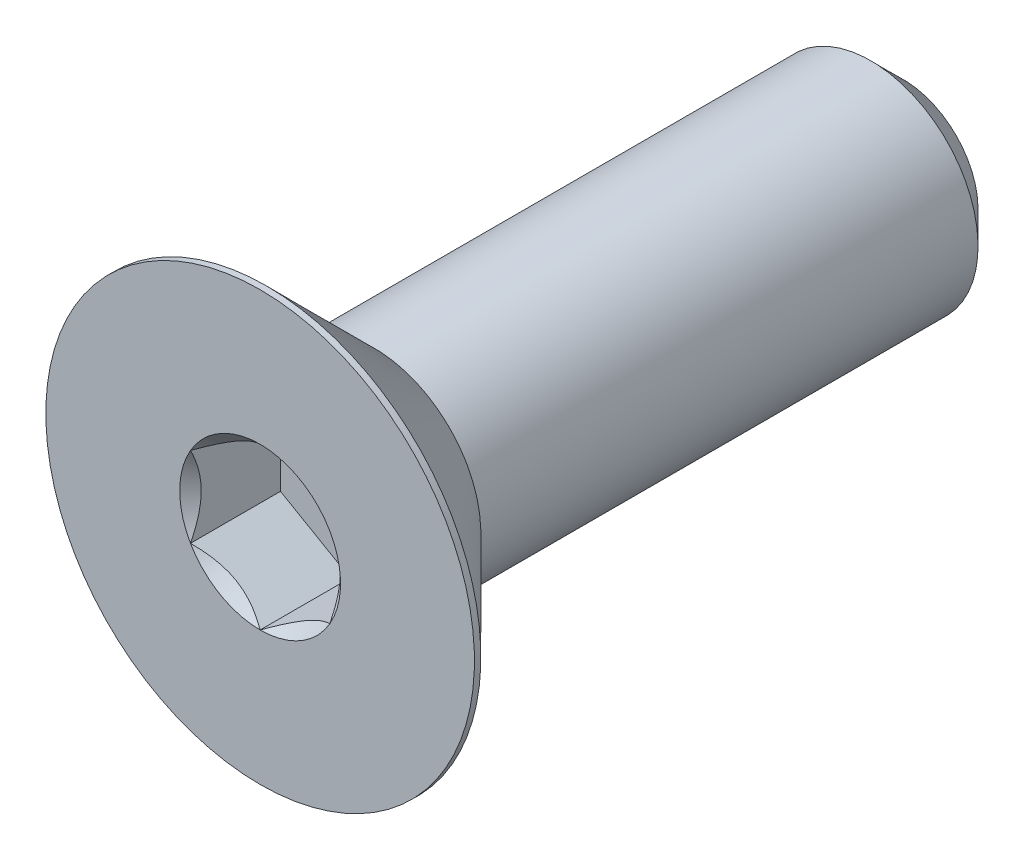
ISO-10303-21;
HEADER;
FILE_DESCRIPTION(('STEP AP214'),'2;1');
FILE_NAME('part.step','',(''),(''),'','','');
FILE_SCHEMA(('AUTOMOTIVE_DESIGN { 1 0 10303 214 1 1 1 1 }'));
ENDSEC;
DATA;
#1=APPLICATION_CONTEXT('core data for automotive mechanical design processes');
#2=APPLICATION_PROTOCOL_DEFINITION('international standard','automotive_design',2000,#1);
#3=PRODUCT_CONTEXT('',#1,'mechanical');
#4=PRODUCT('Part','Part','',(#3));
#5=PRODUCT_RELATED_PRODUCT_CATEGORY('part','',(#4));
#6=PRODUCT_DEFINITION_FORMATION('','',#4);
#7=PRODUCT_DEFINITION_CONTEXT('part definition',#1,'design');
#8=PRODUCT_DEFINITION('design','',#6,#7);
#9=PRODUCT_DEFINITION_SHAPE('','',#8);
#10=(LENGTH_UNIT() NAMED_UNIT(*) SI_UNIT(.MILLI.,.METRE.));
#11=(NAMED_UNIT(*) PLANE_ANGLE_UNIT() SI_UNIT($,.RADIAN.));
#12=(NAMED_UNIT(*) SI_UNIT($,.STERADIAN.) SOLID_ANGLE_UNIT());
#13=UNCERTAINTY_MEASURE_WITH_UNIT(LENGTH_MEASURE(1.E-05),#10,'distance_accuracy_value','');
#14=(GEOMETRIC_REPRESENTATION_CONTEXT(3) GLOBAL_UNCERTAINTY_ASSIGNED_CONTEXT((#13)) GLOBAL_UNIT_ASSIGNED_CONTEXT((#10,
#11,#12)) REPRESENTATION_CONTEXT('',''));
#15=CARTESIAN_POINT('',(0.,0.,0.));
#16=DIRECTION('',(0.,0.,1.));
#17=DIRECTION('',(1.,0.,0.));
#18=AXIS2_PLACEMENT_3D('',#15,#16,#17);
#19=CARTESIAN_POINT('',(0.,0.,3.));
#20=DIRECTION('',(0.,0.,-1.));
#21=DIRECTION('',(0.,1.,0.));
#22=AXIS2_PLACEMENT_3D('',#19,#20,#21);
#23=PLANE('',#22);
#24=CARTESIAN_POINT('',(0.,0.,3.));
#25=DIRECTION('',(0.,0.,1.));
#26=DIRECTION('',(0.,-1.,0.));
#27=AXIS2_PLACEMENT_3D('',#24,#25,#26);
#28=CIRCLE('',#27,2.);
#29=CARTESIAN_POINT('',(0.,-2.,3.));
#30=VERTEX_POINT('',#29);
#31=EDGE_CURVE('E228',#30,#30,#28,.T.);
#32=ORIENTED_EDGE('',*,*,#31,.T.);
#33=EDGE_LOOP('',(#32));
#34=FACE_BOUND('',#33,.T.);
#35=CARTESIAN_POINT('',(0.,0.,3.));
#36=DIRECTION('',(0.,0.,-1.));
#37=DIRECTION('',(-1.,0.,0.));
#38=AXIS2_PLACEMENT_3D('',#35,#36,#37);
#39=CIRCLE('',#38,0.750555349946515);
#40=CARTESIAN_POINT('',(-0.650000000000003,0.375277674973255,3.));
#41=VERTEX_POINT('',#40);
#42=CARTESIAN_POINT('',(0.,0.750555349946516,3.));
#43=VERTEX_POINT('',#42);
#44=EDGE_CURVE('E144',#41,#43,#39,.T.);
#45=ORIENTED_EDGE('',*,*,#44,.T.);
#46=CARTESIAN_POINT('',(0.650000000000002,0.375277674973256,3.));
#47=VERTEX_POINT('',#46);
#48=EDGE_CURVE('E143',#43,#47,#39,.T.);
#49=ORIENTED_EDGE('',*,*,#48,.T.);
#50=CARTESIAN_POINT('',(0.650000000000002,-0.375277674973256,3.));
#51=VERTEX_POINT('',#50);
#52=EDGE_CURVE('E115',#47,#51,#39,.T.);
#53=ORIENTED_EDGE('',*,*,#52,.T.);
#54=CARTESIAN_POINT('',(0.,-0.750555349946515,3.));
#55=VERTEX_POINT('',#54);
#56=EDGE_CURVE('E108',#51,#55,#39,.T.);
#57=ORIENTED_EDGE('',*,*,#56,.T.);
#58=CARTESIAN_POINT('',(-0.650000000000001,-0.375277674973258,3.));
#59=VERTEX_POINT('',#58);
#60=EDGE_CURVE('E69',#55,#59,#39,.T.);
#61=ORIENTED_EDGE('',*,*,#60,.T.);
#62=EDGE_CURVE('E76',#59,#41,#39,.T.);
#63=ORIENTED_EDGE('',*,*,#62,.T.);
#64=EDGE_LOOP('',(#45,#49,#53,#57,#61,#63));
#65=FACE_BOUND('',#64,.T.);
#66=ADVANCED_FACE('F49',(#34,#65),#23,.F.);
#67=CARTESIAN_POINT('',(0.,0.,2.94000000000001));
#68=DIRECTION('',(0.,0.,1.));
#69=DIRECTION('',(0.,-1.,0.));
#70=AXIS2_PLACEMENT_3D('',#67,#68,#69);
#71=CONICAL_SURFACE('',#70,2.,0.785398163397448);
#72=CARTESIAN_POINT('',(0.,0.,1.8));
#73=DIRECTION('',(0.,0.,1.));
#74=DIRECTION('',(0.,-1.,0.));
#75=AXIS2_PLACEMENT_3D('',#72,#73,#74);
#76=CIRCLE('',#75,0.859999999999998);
#77=CARTESIAN_POINT('',(0.,-0.859999999999998,1.8));
#78=VERTEX_POINT('',#77);
#79=EDGE_CURVE('E229',#78,#78,#76,.T.);
#80=ORIENTED_EDGE('',*,*,#79,.T.);
#81=EDGE_LOOP('',(#80));
#82=FACE_BOUND('',#81,.T.);
#83=CARTESIAN_POINT('',(0.,0.,2.94000000000001));
#84=DIRECTION('',(0.,0.,1.));
#85=DIRECTION('',(0.,-1.,0.));
#86=AXIS2_PLACEMENT_3D('',#83,#84,#85);
#87=CIRCLE('',#86,2.);
#88=CARTESIAN_POINT('',(0.,-2.,2.94000000000001));
#89=VERTEX_POINT('',#88);
#90=EDGE_CURVE('E63',#89,#89,#87,.T.);
#91=ORIENTED_EDGE('',*,*,#90,.F.);
#92=EDGE_LOOP('',(#91));
#93=FACE_BOUND('',#92,.T.);
#94=ADVANCED_FACE('F51',(#82,#93),#71,.T.);
#95=CARTESIAN_POINT('',(0.,0.,3.));
#96=DIRECTION('',(0.,0.,1.));
#97=DIRECTION('',(0.,-1.,0.));
#98=AXIS2_PLACEMENT_3D('',#95,#96,#97);
#99=CYLINDRICAL_SURFACE('',#98,2.);
#100=ORIENTED_EDGE('',*,*,#90,.T.);
#101=EDGE_LOOP('',(#100));
#102=FACE_BOUND('',#101,.T.);
#103=ORIENTED_EDGE('',*,*,#31,.F.);
#104=EDGE_LOOP('',(#103));
#105=FACE_BOUND('',#104,.T.);
#106=ADVANCED_FACE('F213',(#102,#105),#99,.T.);
#107=CARTESIAN_POINT('',(0.,0.,1.8));
#108=DIRECTION('',(0.,0.,-1.));
#109=DIRECTION('',(0.,1.,0.));
#110=AXIS2_PLACEMENT_3D('',#107,#108,#109);
#111=PLANE('',#110);
#112=ORIENTED_EDGE('',*,*,#79,.F.);
#113=EDGE_LOOP('',(#112));
#114=FACE_BOUND('',#113,.T.);
#115=ADVANCED_FACE('F217',(#114),#111,.T.);
#116=CARTESIAN_POINT('',(0.,0.,3.));
#117=DIRECTION('',(0.,0.,1.));
#118=DIRECTION('',(-1.,0.,0.));
#119=AXIS2_PLACEMENT_3D('',#116,#117,#118);
#120=CONICAL_SURFACE('',#119,0.750555349946515,0.78539816339745);
#121=CARTESIAN_POINT('',(0.650000000000002,-0.748456856202004,3.24075069038401));
#122=CARTESIAN_POINT('',(0.650000000000002,-0.711991073878827,3.21328028593363));
#123=CARTESIAN_POINT('',(0.650000000000002,-0.675139640082804,3.1862651954762));
#124=CARTESIAN_POINT('',(0.650000000000002,-0.600031183452829,3.13362934828317));
#125=CARTESIAN_POINT('',(0.650000000000002,-0.561765441270903,3.1080211061291));
#126=CARTESIAN_POINT('',(0.650000000000002,-0.481525479406327,3.05773749376247));
#127=CARTESIAN_POINT('',(0.650000000000002,-0.439464253670492,3.03319880219876));
#128=CARTESIAN_POINT('',(0.650000000000002,-0.353242719412724,2.98831465969864));
#129=CARTESIAN_POINT('',(0.650000000000002,-0.309090130602529,2.96795507248949));
#130=CARTESIAN_POINT('',(0.650000000000002,-0.242810057498672,2.94304872908866));
#131=CARTESIAN_POINT('',(0.650000000000002,-0.221667349821692,2.93590072741472));
#132=CARTESIAN_POINT('',(0.650000000000002,-0.178882845085545,2.92329752945255));
#133=CARTESIAN_POINT('',(0.650000000000002,-0.157241013753966,2.91784244978313));
#134=CARTESIAN_POINT('',(0.650000000000002,-0.0924732258239357,2.90466076531023));
#135=CARTESIAN_POINT('',(0.650000000000002,-0.0486986201802786,2.89979355976944));
#136=CARTESIAN_POINT('',(0.650000000000002,0.0373331587621231,2.89914448923078));
#137=CARTESIAN_POINT('',(0.650000000000002,0.0795879418799262,2.90304033931981));
#138=CARTESIAN_POINT('',(0.650000000000002,0.142230570834975,2.91449232559784));
#139=CARTESIAN_POINT('',(0.650000000000002,0.163174856664669,2.91931456423673));
#140=CARTESIAN_POINT('',(0.650000000000002,0.204615212735414,2.93060009995474));
#141=CARTESIAN_POINT('',(0.650000000000002,0.225111320324617,2.93706325972015));
#142=CARTESIAN_POINT('',(0.650000000000002,0.289638534772371,2.95984409213164));
#143=CARTESIAN_POINT('',(0.650000000000002,0.332748206875051,2.9787572451342));
#144=CARTESIAN_POINT('',(0.650000000000002,0.416943840013234,3.02081128188878));
#145=CARTESIAN_POINT('',(0.650000000000002,0.45802183453077,3.04396735475778));
#146=CARTESIAN_POINT('',(0.650000000000002,0.536529233245991,3.09172663971809));
#147=CARTESIAN_POINT('',(0.650000000000002,0.574038509134623,3.11620075812716));
#148=CARTESIAN_POINT('',(0.650000000000002,0.647609691485458,3.16662345601489));
#149=CARTESIAN_POINT('',(0.650000000000002,0.683680924535921,3.19255834365529));
#150=CARTESIAN_POINT('',(0.650000000000002,0.719356204751143,3.21896687739743));
#151=B_SPLINE_CURVE_WITH_KNOTS('',3,(#121,#122,#123,#124,#125,#126,#127,#128,#129,#130,#131,
#132,#133,#134,#135,#136,#137,#138,#139,#140,#141,#142,#143,#144,#145,#146,#147,#148,#149,#150),
.UNSPECIFIED.,.F.,.F.,(4,2,2,2,2,2,2,2,2,2,2,2,2,2,4),(0.,0.13701403000958,0.275096405762555,
0.421060359835528,0.566522128775098,0.633415056462926,0.70031259112181,0.831534924508346,
0.958010408789909,1.02242898521266,1.08684217280829,1.22766018796414,1.36899252873704,
1.50330165960874,1.63651263433844),.UNSPECIFIED.);
#152=EDGE_CURVE('E12',#47,#51,#151,.F.);
#153=ORIENTED_EDGE('',*,*,#152,.T.);
#154=ORIENTED_EDGE('',*,*,#52,.F.);
#155=EDGE_LOOP('',(#153,#154));
#156=FACE_BOUND('',#155,.T.);
#157=ADVANCED_FACE('F120',(#156),#120,.F.);
#158=CARTESIAN_POINT('',(-0.000199999999999783,0.750670820000351,3.00011549669667));
#159=CARTESIAN_POINT('',(0.0221538754426208,0.737764803996123,2.98721736219155));
#160=CARTESIAN_POINT('',(0.0448801205326127,0.724643800275747,2.97507515489864));
#161=CARTESIAN_POINT('',(0.0912219846432824,0.697888312556702,2.95284224486223));
#162=CARTESIAN_POINT('',(0.114842019040596,0.684251279339145,2.94276392481001));
#163=CARTESIAN_POINT('',(0.162473808706856,0.656751052753347,2.92550151642337));
#164=CARTESIAN_POINT('',(0.186473364593086,0.642894902702,2.91827395851558));
#165=CARTESIAN_POINT('',(0.234989410245209,0.614884150684731,2.90712920200001));
#166=CARTESIAN_POINT('',(0.25950444404188,0.60073038932303,2.90320370262187));
#167=CARTESIAN_POINT('',(0.31938440233592,0.566158679282903,2.89822343733471));
#168=CARTESIAN_POINT('',(0.354889192903235,0.545659978891342,2.89912448479266));
#169=CARTESIAN_POINT('',(0.425154552317994,0.505092254718525,2.90840856131667));
#170=CARTESIAN_POINT('',(0.459913930439301,0.485023918403324,2.91680276302966));
#171=CARTESIAN_POINT('',(0.52095826250894,0.449779956850418,2.9370456785073));
#172=CARTESIAN_POINT('',(0.547523861415086,0.434442301170771,2.9478384232645));
#173=CARTESIAN_POINT('',(0.599614154899068,0.404367956205627,2.9721519314496));
#174=CARTESIAN_POINT('',(0.625141918825038,0.389629494831159,2.98566382100729));
#175=CARTESIAN_POINT('',(0.650200000000002,0.375162204919418,3.00011549669668));
#176=B_SPLINE_CURVE_WITH_KNOTS('',3,(#158,#159,#160,#161,#162,#163,#164,#165,#166,#167,#168,
#169,#170,#171,#172,#173,#174,#175),.UNSPECIFIED.,.F.,.F.,(4,2,2,2,2,2,2,2,4),(0.,
0.0866236559063441,0.173752711623242,0.259496442803568,0.345023980281752,0.467267720550124,
0.589694037029335,0.687111308755481,0.784215671813668),.UNSPECIFIED.);
#177=EDGE_CURVE('E146',#43,#47,#176,.T.);
#178=ORIENTED_EDGE('',*,*,#177,.T.);
#179=ORIENTED_EDGE('',*,*,#48,.F.);
#180=EDGE_LOOP('',(#178,#179));
#181=FACE_BOUND('',#180,.T.);
#182=ADVANCED_FACE('F267',(#181),#120,.F.);
#183=CARTESIAN_POINT('',(-0.650200000000001,0.375162204919418,3.00011549669668));
#184=CARTESIAN_POINT('',(-0.627846124557381,0.388068220923646,2.98721736219155));
#185=CARTESIAN_POINT('',(-0.605119879467389,0.401189224644023,2.97507515489864));
#186=CARTESIAN_POINT('',(-0.558778015356719,0.427944712363067,2.95284224486223));
#187=CARTESIAN_POINT('',(-0.535157980959404,0.441581745580625,2.94276392481001));
#188=CARTESIAN_POINT('',(-0.487526191293145,0.469081972166423,2.92550151642338));
#189=CARTESIAN_POINT('',(-0.463526635406915,0.48293812221777,2.91827395851558));
#190=CARTESIAN_POINT('',(-0.415010589754791,0.510948874235039,2.90712920200001));
#191=CARTESIAN_POINT('',(-0.390495555958119,0.52510263559674,2.90320370262187));
#192=CARTESIAN_POINT('',(-0.33061559766408,0.559674345636867,2.89822343733471));
#193=CARTESIAN_POINT('',(-0.295110807096765,0.580173046028428,2.89912448479266));
#194=CARTESIAN_POINT('',(-0.224845447682006,0.620740770201245,2.90840856131667));
#195=CARTESIAN_POINT('',(-0.190086069560699,0.640809106516446,2.91680276302966));
#196=CARTESIAN_POINT('',(-0.129041737491061,0.676053068069352,2.9370456785073));
#197=CARTESIAN_POINT('',(-0.102476138584915,0.691390723748999,2.9478384232645));
#198=CARTESIAN_POINT('',(-0.0503858451009331,0.721465068714143,2.9721519314496));
#199=CARTESIAN_POINT('',(-0.0248580811749639,0.73620353008861,2.98566382100729));
#200=CARTESIAN_POINT('',(0.000200000000000409,0.750670820000351,3.00011549669667));
#201=B_SPLINE_CURVE_WITH_KNOTS('',3,(#183,#184,#185,#186,#187,#188,#189,#190,#191,#192,#193,
#194,#195,#196,#197,#198,#199,#200),.UNSPECIFIED.,.F.,.F.,(4,2,2,2,2,2,2,2,4),(0.,
0.0866236559063447,0.173752711623243,0.25949644280357,0.345023980281754,0.467267720550127,
0.589694037029337,0.687111308755482,0.784215671813668),.UNSPECIFIED.);
#202=EDGE_CURVE('E153',#41,#43,#201,.T.);
#203=ORIENTED_EDGE('',*,*,#202,.T.);
#204=ORIENTED_EDGE('',*,*,#44,.F.);
#205=EDGE_LOOP('',(#203,#204));
#206=FACE_BOUND('',#205,.T.);
#207=ADVANCED_FACE('F263',(#206),#120,.F.);
#208=CARTESIAN_POINT('',(-0.650000000000001,-0.748456856202007,3.24075069038402));
#209=CARTESIAN_POINT('',(-0.650000000000001,-0.711991073878829,3.21328028593363));
#210=CARTESIAN_POINT('',(-0.650000000000001,-0.675139640082806,3.1862651954762));
#211=CARTESIAN_POINT('',(-0.650000000000001,-0.60003118345283,3.13362934828317));
#212=CARTESIAN_POINT('',(-0.650000000000001,-0.561765441270904,3.1080211061291));
#213=CARTESIAN_POINT('',(-0.650000000000001,-0.481525479406329,3.05773749376247));
#214=CARTESIAN_POINT('',(-0.650000000000001,-0.439464253670493,3.03319880219876));
#215=CARTESIAN_POINT('',(-0.650000000000001,-0.353242719412725,2.98831465969864));
#216=CARTESIAN_POINT('',(-0.650000000000001,-0.30909013060253,2.96795507248949));
#217=CARTESIAN_POINT('',(-0.650000000000001,-0.242810057498673,2.94304872908865));
#218=CARTESIAN_POINT('',(-0.650000000000001,-0.221667349821693,2.93590072741472));
#219=CARTESIAN_POINT('',(-0.650000000000001,-0.178882845085546,2.92329752945255));
#220=CARTESIAN_POINT('',(-0.650000000000001,-0.157241013753967,2.91784244978313));
#221=CARTESIAN_POINT('',(-0.650000000000001,-0.0924732258239366,2.90466076531023));
#222=CARTESIAN_POINT('',(-0.650000000000001,-0.0486986201802795,2.89979355976944));
#223=CARTESIAN_POINT('',(-0.650000000000001,0.0373331587621224,2.89914448923078));
#224=CARTESIAN_POINT('',(-0.650000000000001,0.0795879418799256,2.90304033931981));
#225=CARTESIAN_POINT('',(-0.650000000000001,0.142230570834974,2.91449232559783));
#226=CARTESIAN_POINT('',(-0.650000000000001,0.163174856664668,2.91931456423673));
#227=CARTESIAN_POINT('',(-0.650000000000001,0.204615212735413,2.93060009995474));
#228=CARTESIAN_POINT('',(-0.650000000000001,0.225111320324616,2.93706325972015));
#229=CARTESIAN_POINT('',(-0.650000000000002,0.28963853477237,2.95984409213164));
#230=CARTESIAN_POINT('',(-0.650000000000001,0.332748206875051,2.9787572451342));
#231=CARTESIAN_POINT('',(-0.650000000000001,0.416943840013234,3.02081128188878));
#232=CARTESIAN_POINT('',(-0.650000000000001,0.45802183453077,3.04396735475778));
#233=CARTESIAN_POINT('',(-0.650000000000001,0.536529233245989,3.09172663971809));
#234=CARTESIAN_POINT('',(-0.650000000000002,0.574038509134622,3.11620075812716));
#235=CARTESIAN_POINT('',(-0.650000000000002,0.647609691485457,3.16662345601488));
#236=CARTESIAN_POINT('',(-0.650000000000002,0.68368092453592,3.19255834365529));
#237=CARTESIAN_POINT('',(-0.650000000000002,0.719356204751141,3.21896687739743));
#238=B_SPLINE_CURVE_WITH_KNOTS('',3,(#208,#209,#210,#211,#212,#213,#214,#215,#216,#217,#218,
#219,#220,#221,#222,#223,#224,#225,#226,#227,#228,#229,#230,#231,#232,#233,#234,#235,#236,#237),
.UNSPECIFIED.,.F.,.F.,(4,2,2,2,2,2,2,2,2,2,2,2,2,2,4),(0.,0.137014030009581,0.275096405762556,
0.42106035983553,0.5665221287751,0.633415056462928,0.700312591121813,0.831534924508348,
0.958010408789912,1.02242898521267,1.0868421728083,1.22766018796414,1.36899252873705,
1.50330165960874,1.63651263433844),.UNSPECIFIED.);
#239=EDGE_CURVE('E173',#59,#41,#238,.T.);
#240=ORIENTED_EDGE('',*,*,#239,.T.);
#241=ORIENTED_EDGE('',*,*,#62,.F.);
#242=EDGE_LOOP('',(#240,#241));
#243=FACE_BOUND('',#242,.T.);
#244=ADVANCED_FACE('F273',(#243),#120,.F.);
#245=CARTESIAN_POINT('',(0.000199999999999492,-0.750670820000355,3.00011549669668));
#246=CARTESIAN_POINT('',(-0.0221538754426212,-0.737764803996126,2.98721736219155));
#247=CARTESIAN_POINT('',(-0.0448801205326133,-0.72464380027575,2.97507515489864));
#248=CARTESIAN_POINT('',(-0.0912219846432834,-0.697888312556705,2.95284224486223));
#249=CARTESIAN_POINT('',(-0.114842019040598,-0.684251279339148,2.94276392481001));
#250=CARTESIAN_POINT('',(-0.162473808706857,-0.656751052753349,2.92550151642338));
#251=CARTESIAN_POINT('',(-0.186473364593087,-0.642894902702003,2.91827395851558));
#252=CARTESIAN_POINT('',(-0.234989410245211,-0.614884150684733,2.90712920200001));
#253=CARTESIAN_POINT('',(-0.259504444041883,-0.600730389323032,2.90320370262187));
#254=CARTESIAN_POINT('',(-0.319384402335922,-0.566158679282905,2.89822343733471));
#255=CARTESIAN_POINT('',(-0.354889192903237,-0.545659978891344,2.89912448479266));
#256=CARTESIAN_POINT('',(-0.425154552317997,-0.505092254718527,2.90840856131667));
#257=CARTESIAN_POINT('',(-0.459913930439304,-0.485023918403326,2.91680276302966));
#258=CARTESIAN_POINT('',(-0.520958262508942,-0.44977995685042,2.9370456785073));
#259=CARTESIAN_POINT('',(-0.547523861415088,-0.434442301170773,2.94783842326451));
#260=CARTESIAN_POINT('',(-0.599614154899068,-0.40436795620563,2.97215193144961));
#261=CARTESIAN_POINT('',(-0.625141918825037,-0.389629494831163,2.98566382100729));
#262=CARTESIAN_POINT('',(-0.650200000000001,-0.375162204919422,3.00011549669668));
#263=B_SPLINE_CURVE_WITH_KNOTS('',3,(#245,#246,#247,#248,#249,#250,#251,#252,#253,#254,#255,
#256,#257,#258,#259,#260,#261,#262),.UNSPECIFIED.,.F.,.F.,(4,2,2,2,2,2,2,2,4),(0.,
0.0866236559063448,0.173752711623243,0.25949644280357,0.345023980281754,0.467267720550128,
0.589694037029339,0.687111308755482,0.784215671813666),.UNSPECIFIED.);
#264=EDGE_CURVE('E132',#55,#59,#263,.T.);
#265=ORIENTED_EDGE('',*,*,#264,.T.);
#266=ORIENTED_EDGE('',*,*,#60,.F.);
#267=EDGE_LOOP('',(#265,#266));
#268=FACE_BOUND('',#267,.T.);
#269=ADVANCED_FACE('F166',(#268),#120,.F.);
#270=CARTESIAN_POINT('',(0.650200000000002,-0.375162204919421,3.00011549669668));
#271=CARTESIAN_POINT('',(0.627846124557381,-0.388068220923649,2.98721736219155));
#272=CARTESIAN_POINT('',(0.605119879467389,-0.401189224644025,2.97507515489864));
#273=CARTESIAN_POINT('',(0.558778015356719,-0.42794471236307,2.95284224486223));
#274=CARTESIAN_POINT('',(0.535157980959405,-0.441581745580627,2.94276392481001));
#275=CARTESIAN_POINT('',(0.487526191293146,-0.469081972166426,2.92550151642338));
#276=CARTESIAN_POINT('',(0.463526635406915,-0.482938122217772,2.91827395851558));
#277=CARTESIAN_POINT('',(0.415010589754792,-0.510948874235042,2.90712920200001));
#278=CARTESIAN_POINT('',(0.39049555595812,-0.525102635596743,2.90320370262187));
#279=CARTESIAN_POINT('',(0.330615597664081,-0.55967434563687,2.89822343733471));
#280=CARTESIAN_POINT('',(0.295110807096766,-0.580173046028431,2.89912448479266));
#281=CARTESIAN_POINT('',(0.224845447682006,-0.620740770201248,2.90840856131667));
#282=CARTESIAN_POINT('',(0.190086069560699,-0.640809106516449,2.91680276302966));
#283=CARTESIAN_POINT('',(0.129041737491061,-0.676053068069356,2.9370456785073));
#284=CARTESIAN_POINT('',(0.102476138584915,-0.691390723749003,2.94783842326451));
#285=CARTESIAN_POINT('',(0.050385845100933,-0.721465068714146,2.97215193144961));
#286=CARTESIAN_POINT('',(0.0248580811749639,-0.736203530088614,2.98566382100729));
#287=CARTESIAN_POINT('',(-0.000200000000000477,-0.750670820000355,3.00011549669668));
#288=B_SPLINE_CURVE_WITH_KNOTS('',3,(#270,#271,#272,#273,#274,#275,#276,#277,#278,#279,#280,
#281,#282,#283,#284,#285,#286,#287),.UNSPECIFIED.,.F.,.F.,(4,2,2,2,2,2,2,2,4),(0.,
0.086623655906345,0.173752711623243,0.259496442803569,0.345023980281754,0.467267720550127,
0.589694037029338,0.687111308755484,0.784215671813669),.UNSPECIFIED.);
#289=EDGE_CURVE('E111',#51,#55,#288,.T.);
#290=ORIENTED_EDGE('',*,*,#289,.T.);
#291=ORIENTED_EDGE('',*,*,#56,.F.);
#292=EDGE_LOOP('',(#290,#291));
#293=FACE_BOUND('',#292,.T.);
#294=ADVANCED_FACE('F109',(#293),#120,.F.);
#295=CARTESIAN_POINT('',(0.650000000000002,-0.375277674973258,2.16));
#296=DIRECTION('',(0.,0.,1.));
#297=DIRECTION('',(1.,0.,0.));
#298=AXIS2_PLACEMENT_3D('',#295,#296,#297);
#299=PLANE('',#298);
#300=DIRECTION('',(0.866025403784439,0.5,0.));
#301=VECTOR('',#300,1.);
#302=CARTESIAN_POINT('',(0.,-0.750555349946517,2.16));
#303=LINE('',#302,#301);
#304=CARTESIAN_POINT('',(0.,-0.750555349946517,2.16));
#305=VERTEX_POINT('',#304);
#306=CARTESIAN_POINT('',(0.650000000000002,-0.375277674973259,2.16));
#307=VERTEX_POINT('',#306);
#308=EDGE_CURVE('E131',#305,#307,#303,.T.);
#309=ORIENTED_EDGE('',*,*,#308,.T.);
#310=DIRECTION('',(0.,1.,0.));
#311=VECTOR('',#310,1.);
#312=CARTESIAN_POINT('',(0.650000000000002,-0.375277674973259,2.16));
#313=LINE('',#312,#311);
#314=CARTESIAN_POINT('',(0.650000000000002,0.375277674973256,2.16));
#315=VERTEX_POINT('',#314);
#316=EDGE_CURVE('E136',#307,#315,#313,.T.);
#317=ORIENTED_EDGE('',*,*,#316,.T.);
#318=DIRECTION('',(-0.866025403784439,0.499999999999999,0.));
#319=VECTOR('',#318,1.);
#320=CARTESIAN_POINT('',(0.650000000000002,0.375277674973256,2.16));
#321=LINE('',#320,#319);
#322=CARTESIAN_POINT('',(0.,0.750555349946513,2.16));
#323=VERTEX_POINT('',#322);
#324=EDGE_CURVE('E253',#315,#323,#321,.T.);
#325=ORIENTED_EDGE('',*,*,#324,.T.);
#326=DIRECTION('',(-0.866025403784439,-0.5,0.));
#327=VECTOR('',#326,1.);
#328=CARTESIAN_POINT('',(0.,0.750555349946513,2.16));
#329=LINE('',#328,#327);
#330=CARTESIAN_POINT('',(-0.650000000000001,0.375277674973256,2.16));
#331=VERTEX_POINT('',#330);
#332=EDGE_CURVE('E250',#323,#331,#329,.T.);
#333=ORIENTED_EDGE('',*,*,#332,.T.);
#334=DIRECTION('',(0.,-1.,0.));
#335=VECTOR('',#334,1.);
#336=CARTESIAN_POINT('',(-0.650000000000001,0.375277674973256,2.16));
#337=LINE('',#336,#335);
#338=CARTESIAN_POINT('',(-0.650000000000001,-0.37527767497326,2.16));
#339=VERTEX_POINT('',#338);
#340=EDGE_CURVE('E247',#331,#339,#337,.T.);
#341=ORIENTED_EDGE('',*,*,#340,.T.);
#342=DIRECTION('',(0.866025403784439,-0.5,0.));
#343=VECTOR('',#342,1.);
#344=CARTESIAN_POINT('',(-0.650000000000001,-0.37527767497326,2.16));
#345=LINE('',#344,#343);
#346=EDGE_CURVE('E139',#339,#305,#345,.T.);
#347=ORIENTED_EDGE('',*,*,#346,.T.);
#348=EDGE_LOOP('',(#309,#317,#325,#333,#341,#347));
#349=FACE_BOUND('',#348,.T.);
#350=ADVANCED_FACE('F165',(#349),#299,.T.);
#351=CARTESIAN_POINT('',(0.650000000000002,-0.375277674973259,2.16));
#352=DIRECTION('',(1.,0.,0.));
#353=DIRECTION('',(0.,0.,-1.));
#354=AXIS2_PLACEMENT_3D('',#351,#352,#353);
#355=PLANE('',#354);
#356=ORIENTED_EDGE('',*,*,#152,.F.);
#357=DIRECTION('',(0.,0.,1.));
#358=VECTOR('',#357,1.);
#359=CARTESIAN_POINT('',(0.650000000000002,0.375277674973256,2.16));
#360=LINE('',#359,#358);
#361=EDGE_CURVE('E138',#315,#47,#360,.T.);
#362=ORIENTED_EDGE('',*,*,#361,.F.);
#363=ORIENTED_EDGE('',*,*,#316,.F.);
#364=DIRECTION('',(0.,0.,1.));
#365=VECTOR('',#364,1.);
#366=CARTESIAN_POINT('',(0.650000000000002,-0.375277674973259,2.16));
#367=LINE('',#366,#365);
#368=EDGE_CURVE('E128',#307,#51,#367,.T.);
#369=ORIENTED_EDGE('',*,*,#368,.T.);
#370=EDGE_LOOP('',(#356,#362,#363,#369));
#371=FACE_BOUND('',#370,.T.);
#372=ADVANCED_FACE('F134',(#371),#355,.F.);
#373=CARTESIAN_POINT('',(0.650000000000002,0.375277674973256,2.16));
#374=DIRECTION('',(0.499999999999999,0.866025403784439,0.));
#375=DIRECTION('',(-0.866025403784439,0.499999999999999,0.));
#376=AXIS2_PLACEMENT_3D('',#373,#374,#375);
#377=PLANE('',#376);
#378=ORIENTED_EDGE('',*,*,#177,.F.);
#379=DIRECTION('',(0.,0.,1.));
#380=VECTOR('',#379,1.);
#381=CARTESIAN_POINT('',(0.,0.750555349946513,2.16));
#382=LINE('',#381,#380);
#383=EDGE_CURVE('E235',#323,#43,#382,.T.);
#384=ORIENTED_EDGE('',*,*,#383,.F.);
#385=ORIENTED_EDGE('',*,*,#324,.F.);
#386=ORIENTED_EDGE('',*,*,#361,.T.);
#387=EDGE_LOOP('',(#378,#384,#385,#386));
#388=FACE_BOUND('',#387,.T.);
#389=ADVANCED_FACE('F160',(#388),#377,.F.);
#390=CARTESIAN_POINT('',(0.,0.750555349946513,2.16));
#391=DIRECTION('',(-0.5,0.866025403784439,0.));
#392=DIRECTION('',(-0.866025403784439,-0.5,0.));
#393=AXIS2_PLACEMENT_3D('',#390,#391,#392);
#394=PLANE('',#393);
#395=ORIENTED_EDGE('',*,*,#202,.F.);
#396=DIRECTION('',(0.,0.,1.));
#397=VECTOR('',#396,1.);
#398=CARTESIAN_POINT('',(-0.650000000000001,0.375277674973256,2.16));
#399=LINE('',#398,#397);
#400=EDGE_CURVE('E238',#331,#41,#399,.T.);
#401=ORIENTED_EDGE('',*,*,#400,.F.);
#402=ORIENTED_EDGE('',*,*,#332,.F.);
#403=ORIENTED_EDGE('',*,*,#383,.T.);
#404=EDGE_LOOP('',(#395,#401,#402,#403));
#405=FACE_BOUND('',#404,.T.);
#406=ADVANCED_FACE('F197',(#405),#394,.F.);
#407=CARTESIAN_POINT('',(-0.650000000000001,0.375277674973256,2.16));
#408=DIRECTION('',(-1.,0.,0.));
#409=DIRECTION('',(0.,-1.,0.));
#410=AXIS2_PLACEMENT_3D('',#407,#408,#409);
#411=PLANE('',#410);
#412=ORIENTED_EDGE('',*,*,#239,.F.);
#413=DIRECTION('',(0.,0.,1.));
#414=VECTOR('',#413,1.);
#415=CARTESIAN_POINT('',(-0.650000000000001,-0.37527767497326,2.16));
#416=LINE('',#415,#414);
#417=EDGE_CURVE('E241',#339,#59,#416,.T.);
#418=ORIENTED_EDGE('',*,*,#417,.F.);
#419=ORIENTED_EDGE('',*,*,#340,.F.);
#420=ORIENTED_EDGE('',*,*,#400,.T.);
#421=EDGE_LOOP('',(#412,#418,#419,#420));
#422=FACE_BOUND('',#421,.T.);
#423=ADVANCED_FACE('F193',(#422),#411,.F.);
#424=CARTESIAN_POINT('',(-0.650000000000001,-0.37527767497326,2.16));
#425=DIRECTION('',(-0.5,-0.866025403784439,0.));
#426=DIRECTION('',(0.866025403784439,-0.5,0.));
#427=AXIS2_PLACEMENT_3D('',#424,#425,#426);
#428=PLANE('',#427);
#429=ORIENTED_EDGE('',*,*,#264,.F.);
#430=DIRECTION('',(0.,0.,1.));
#431=VECTOR('',#430,1.);
#432=CARTESIAN_POINT('',(0.,-0.750555349946517,2.16));
#433=LINE('',#432,#431);
#434=EDGE_CURVE('E130',#305,#55,#433,.T.);
#435=ORIENTED_EDGE('',*,*,#434,.F.);
#436=ORIENTED_EDGE('',*,*,#346,.F.);
#437=ORIENTED_EDGE('',*,*,#417,.T.);
#438=EDGE_LOOP('',(#429,#435,#436,#437));
#439=FACE_BOUND('',#438,.T.);
#440=ADVANCED_FACE('F190',(#439),#428,.F.);
#441=CARTESIAN_POINT('',(0.,-0.750555349946517,2.16));
#442=DIRECTION('',(0.5,-0.866025403784439,0.));
#443=DIRECTION('',(0.866025403784439,0.5,0.));
#444=AXIS2_PLACEMENT_3D('',#441,#442,#443);
#445=PLANE('',#444);
#446=ORIENTED_EDGE('',*,*,#289,.F.);
#447=ORIENTED_EDGE('',*,*,#368,.F.);
#448=ORIENTED_EDGE('',*,*,#308,.F.);
#449=ORIENTED_EDGE('',*,*,#434,.T.);
#450=EDGE_LOOP('',(#446,#447,#448,#449));
#451=FACE_BOUND('',#450,.T.);
#452=ADVANCED_FACE('F126',(#451),#445,.F.);
#453=CLOSED_SHELL('',(#66,#94,#106,#115,#157,#182,#207,#244,#269,#294,#350,#372,#389,#406,#423,
#440,#452));
#454=MANIFOLD_SOLID_BREP('B2',#453);
#455=CARTESIAN_POINT('',(0.,-1.00000000000001,2.16));
#456=DIRECTION('',(0.,0.,-1.));
#457=DIRECTION('',(0.,1.,0.));
#458=AXIS2_PLACEMENT_3D('',#455,#456,#457);
#459=PLANE('',#458);
#460=CARTESIAN_POINT('',(0.,0.,2.16));
#461=DIRECTION('',(0.,0.,1.));
#462=DIRECTION('',(0.,-1.,0.));
#463=AXIS2_PLACEMENT_3D('',#460,#461,#462);
#464=CIRCLE('',#463,1.00000000000001);
#465=CARTESIAN_POINT('',(0.,-1.00000000000001,2.16));
#466=VERTEX_POINT('',#465);
#467=EDGE_CURVE('E393',#466,#466,#464,.T.);
#468=ORIENTED_EDGE('',*,*,#467,.T.);
#469=EDGE_LOOP('',(#468));
#470=FACE_BOUND('',#469,.T.);
#471=ADVANCED_FACE('F380',(#470),#459,.F.);
#472=CARTESIAN_POINT('',(0.,-1.,-3.00000000000001));
#473=DIRECTION('',(0.,0.,1.));
#474=DIRECTION('',(0.,-1.,0.));
#475=AXIS2_PLACEMENT_3D('',#472,#473,#474);
#476=PLANE('',#475);
#477=CARTESIAN_POINT('',(0.,0.,-3.00000000000001));
#478=DIRECTION('',(0.,0.,1.));
#479=DIRECTION('',(0.,-1.,0.));
#480=AXIS2_PLACEMENT_3D('',#477,#478,#479);
#481=CIRCLE('',#480,0.7);
#482=CARTESIAN_POINT('',(0.,-0.7,-3.00000000000001));
#483=VERTEX_POINT('',#482);
#484=EDGE_CURVE('E48',#483,#483,#481,.F.);
#485=ORIENTED_EDGE('',*,*,#484,.T.);
#486=EDGE_LOOP('',(#485));
#487=FACE_BOUND('',#486,.T.);
#488=ADVANCED_FACE('F404',(#487),#476,.F.);
#489=CARTESIAN_POINT('',(0.,0.,2.16));
#490=DIRECTION('',(0.,0.,1.));
#491=DIRECTION('',(0.,-1.,0.));
#492=AXIS2_PLACEMENT_3D('',#489,#490,#491);
#493=CYLINDRICAL_SURFACE('',#492,1.00000000000001);
#494=CARTESIAN_POINT('',(0.,0.,-2.7));
#495=DIRECTION('',(0.,0.,1.));
#496=DIRECTION('',(0.,-1.,0.));
#497=AXIS2_PLACEMENT_3D('',#494,#495,#496);
#498=CIRCLE('',#497,1.00000000000001);
#499=CARTESIAN_POINT('',(0.,-1.00000000000001,-2.7));
#500=VERTEX_POINT('',#499);
#501=EDGE_CURVE('E388',#500,#500,#498,.T.);
#502=ORIENTED_EDGE('',*,*,#501,.T.);
#503=EDGE_LOOP('',(#502));
#504=FACE_BOUND('',#503,.T.);
#505=ORIENTED_EDGE('',*,*,#467,.F.);
#506=EDGE_LOOP('',(#505));
#507=FACE_BOUND('',#506,.T.);
#508=ADVANCED_FACE('F402',(#504,#507),#493,.T.);
#509=CARTESIAN_POINT('',(0.,0.,-2.7));
#510=DIRECTION('',(0.,0.,1.));
#511=DIRECTION('',(0.,-1.,0.));
#512=AXIS2_PLACEMENT_3D('',#509,#510,#511);
#513=CONICAL_SURFACE('',#512,1.00000000000001,0.78539816339745);
#514=CARTESIAN_POINT('',(0.,-0.7,-3.00000000000001));
#515=CARTESIAN_POINT('',(0.,-0.703125000000001,-2.99687500000001));
#516=CARTESIAN_POINT('',(0.,-0.706250000000001,-2.99375000000001));
#517=CARTESIAN_POINT('',(0.,-0.712500000000001,-2.98750000000001));
#518=CARTESIAN_POINT('',(0.,-0.715625000000001,-2.98437500000001));
#519=CARTESIAN_POINT('',(0.,-0.721875000000001,-2.97812500000001));
#520=CARTESIAN_POINT('',(0.,-0.725000000000001,-2.97500000000001));
#521=CARTESIAN_POINT('',(0.,-0.731250000000001,-2.96875000000001));
#522=CARTESIAN_POINT('',(0.,-0.734375000000001,-2.96562500000001));
#523=CARTESIAN_POINT('',(0.,-0.740625000000001,-2.95937500000001));
#524=CARTESIAN_POINT('',(0.,-0.743750000000001,-2.95625000000001));
#525=CARTESIAN_POINT('',(0.,-0.750000000000001,-2.95000000000001));
#526=CARTESIAN_POINT('',(0.,-0.753125000000001,-2.94687500000001));
#527=CARTESIAN_POINT('',(0.,-0.759375000000002,-2.94062500000001));
#528=CARTESIAN_POINT('',(0.,-0.762500000000002,-2.93750000000001));
#529=CARTESIAN_POINT('',(0.,-0.768750000000002,-2.93125000000001));
#530=CARTESIAN_POINT('',(0.,-0.771875000000002,-2.92812500000001));
#531=CARTESIAN_POINT('',(0.,-0.778125000000002,-2.92187500000001));
#532=CARTESIAN_POINT('',(0.,-0.781250000000002,-2.91875000000001));
#533=CARTESIAN_POINT('',(0.,-0.787500000000002,-2.91250000000001));
#534=CARTESIAN_POINT('',(0.,-0.790625000000002,-2.90937500000001));
#535=CARTESIAN_POINT('',(0.,-0.796875000000002,-2.90312500000001));
#536=CARTESIAN_POINT('',(0.,-0.800000000000002,-2.90000000000001));
#537=CARTESIAN_POINT('',(0.,-0.806250000000003,-2.89375000000001));
#538=CARTESIAN_POINT('',(0.,-0.809375000000003,-2.89062500000001));
#539=CARTESIAN_POINT('',(0.,-0.815625000000003,-2.88437500000001));
#540=CARTESIAN_POINT('',(0.,-0.818750000000003,-2.88125000000001));
#541=CARTESIAN_POINT('',(0.,-0.825000000000003,-2.87500000000001));
#542=CARTESIAN_POINT('',(0.,-0.828125000000003,-2.87187500000001));
#543=CARTESIAN_POINT('',(0.,-0.834375000000003,-2.86562500000001));
#544=CARTESIAN_POINT('',(0.,-0.837500000000003,-2.86250000000001));
#545=CARTESIAN_POINT('',(0.,-0.843750000000003,-2.85625000000001));
#546=CARTESIAN_POINT('',(0.,-0.846875000000003,-2.85312500000001));
#547=CARTESIAN_POINT('',(0.,-0.853125000000003,-2.84687500000001));
#548=CARTESIAN_POINT('',(0.,-0.856250000000004,-2.84375000000001));
#549=CARTESIAN_POINT('',(0.,-0.862500000000004,-2.83750000000001));
#550=CARTESIAN_POINT('',(0.,-0.865625000000004,-2.83437500000001));
#551=CARTESIAN_POINT('',(0.,-0.871875000000004,-2.82812500000001));
#552=CARTESIAN_POINT('',(0.,-0.875000000000004,-2.82500000000001));
#553=CARTESIAN_POINT('',(0.,-0.881250000000004,-2.81875000000001));
#554=CARTESIAN_POINT('',(0.,-0.884375000000004,-2.81562500000001));
#555=CARTESIAN_POINT('',(0.,-0.890625000000004,-2.80937500000001));
#556=CARTESIAN_POINT('',(0.,-0.893750000000004,-2.80625000000001));
#557=CARTESIAN_POINT('',(0.,-0.900000000000004,-2.80000000000001));
#558=CARTESIAN_POINT('',(0.,-0.903125000000005,-2.79687500000001));
#559=CARTESIAN_POINT('',(0.,-0.909375000000005,-2.79062500000001));
#560=CARTESIAN_POINT('',(0.,-0.912500000000005,-2.78750000000001));
#561=CARTESIAN_POINT('',(0.,-0.918750000000005,-2.78125000000001));
#562=CARTESIAN_POINT('',(0.,-0.921875000000005,-2.77812500000001));
#563=CARTESIAN_POINT('',(0.,-0.928125000000005,-2.77187500000001));
#564=CARTESIAN_POINT('',(0.,-0.931250000000005,-2.76875000000001));
#565=CARTESIAN_POINT('',(0.,-0.937500000000005,-2.76250000000001));
#566=CARTESIAN_POINT('',(0.,-0.940625000000005,-2.75937500000001));
#567=CARTESIAN_POINT('',(0.,-0.946875000000005,-2.75312500000001));
#568=CARTESIAN_POINT('',(0.,-0.950000000000005,-2.75));
#569=CARTESIAN_POINT('',(0.,-0.956250000000006,-2.74375));
#570=CARTESIAN_POINT('',(0.,-0.959375000000006,-2.740625));
#571=CARTESIAN_POINT('',(0.,-0.965625000000006,-2.734375));
#572=CARTESIAN_POINT('',(0.,-0.968750000000006,-2.73125000000001));
#573=CARTESIAN_POINT('',(0.,-0.975000000000006,-2.725));
#574=CARTESIAN_POINT('',(0.,-0.978125000000006,-2.721875));
#575=CARTESIAN_POINT('',(0.,-0.984375000000006,-2.715625));
#576=CARTESIAN_POINT('',(0.,-0.987500000000006,-2.7125));
#577=CARTESIAN_POINT('',(0.,-0.993750000000006,-2.70625));
#578=CARTESIAN_POINT('',(0.,-0.996875000000006,-2.703125));
#579=CARTESIAN_POINT('',(0.,-1.00000000000001,-2.7));
#580=B_SPLINE_CURVE_WITH_KNOTS('',3,(#514,#515,#516,#517,#518,#519,#520,#521,#522,#523,#524,
#525,#526,#527,#528,#529,#530,#531,#532,#533,#534,#535,#536,#537,#538,#539,#540,#541,#542,#543,
#544,#545,#546,#547,#548,#549,#550,#551,#552,#553,#554,#555,#556,#557,#558,#559,#560,#561,#562,
#563,#564,#565,#566,#567,#568,#569,#570,#571,#572,#573,#574,#575,#576,#577,#578,#579),
.UNSPECIFIED.,.F.,.F.,(4,2,2,2,2,2,2,2,2,2,2,2,2,2,2,2,2,2,2,2,2,2,2,2,2,2,2,2,2,2,2,2,4),(0.,
0.0132582521472478,0.0265165042944958,0.039774756441744,0.053033008588992,0.0662912607362398,
0.079549512883488,0.092807765030736,0.106066017177984,0.119324269325232,0.13258252147248,
0.145840773619728,0.159099025766976,0.172357277914224,0.185615530061472,0.19887378220872,
0.212132034355968,0.225390286503216,0.238648538650464,0.251906790797712,0.26516504294496,
0.278423295092208,0.291681547239456,0.304939799386704,0.318198051533952,0.3314563036812,
0.344714555828448,0.357972807975696,0.371231060122944,0.384489312270192,0.39774756441744,
0.411005816564688,0.424264068711936),.UNSPECIFIED.);
#581=EDGE_CURVE('BSEAM382',#483,#500,#580,.T.);
#582=ORIENTED_EDGE('',*,*,#484,.F.);
#583=ORIENTED_EDGE('',*,*,#501,.F.);
#584=ORIENTED_EDGE('',*,*,#581,.T.);
#585=ORIENTED_EDGE('',*,*,#581,.F.);
#586=EDGE_LOOP('',(#582,#584,#583,#585));
#587=FACE_BOUND('',#586,.T.);
#588=ADVANCED_FACE('F382',(#587),#513,.T.);
#589=CLOSED_SHELL('',(#471,#488,#508,#588));
#590=MANIFOLD_SOLID_BREP('B6',#589);
#591=ADVANCED_BREP_SHAPE_REPRESENTATION('',(#18,#454,#590),#14);
#592=SHAPE_DEFINITION_REPRESENTATION(#9,#591);
ENDSEC;
END-ISO-10303-21;
